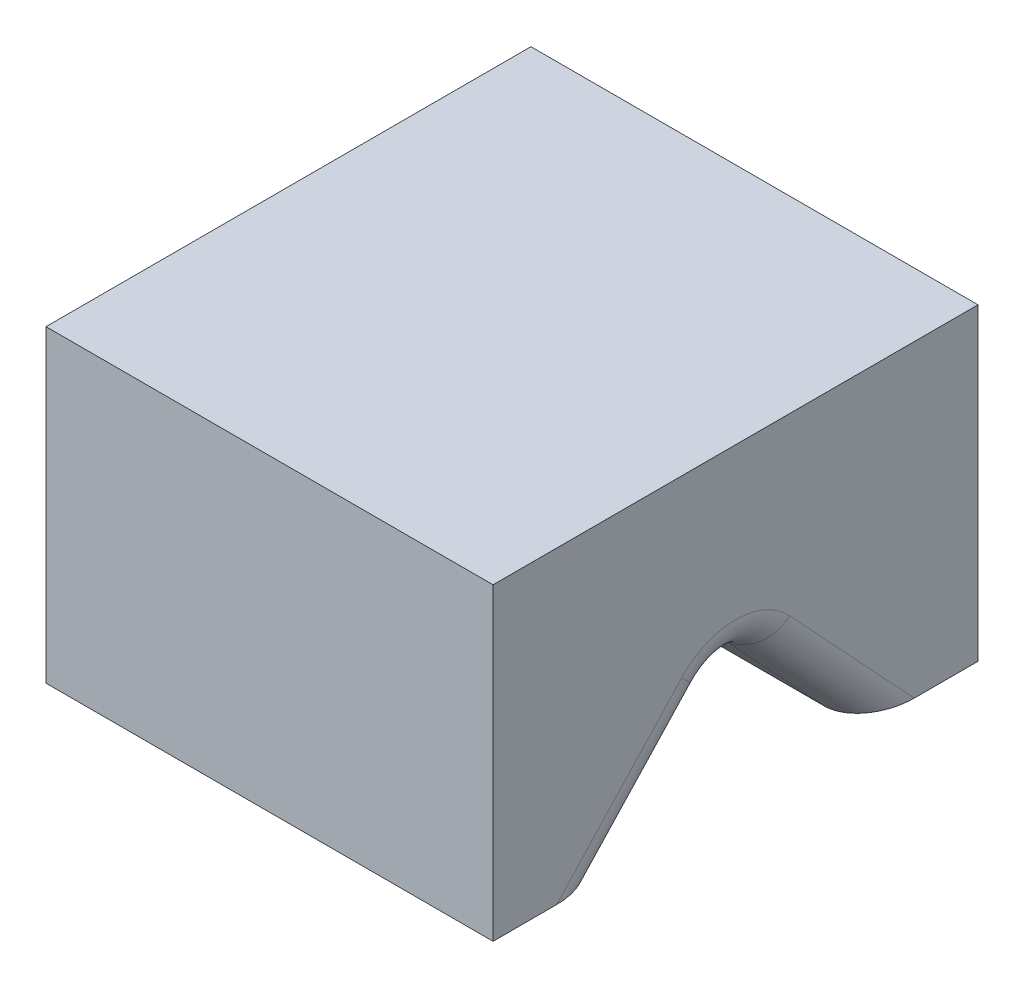
ISO-10303-21;
HEADER;
FILE_DESCRIPTION(('STEP AP214'),'2;1');
FILE_NAME('part.step','',(''),(''),'','','');
FILE_SCHEMA(('AUTOMOTIVE_DESIGN { 1 0 10303 214 1 1 1 1 }'));
ENDSEC;
DATA;
#1=APPLICATION_CONTEXT('core data for automotive mechanical design processes');
#2=APPLICATION_PROTOCOL_DEFINITION('international standard','automotive_design',2000,#1);
#3=PRODUCT_CONTEXT('',#1,'mechanical');
#4=PRODUCT('Part','Part','',(#3));
#5=PRODUCT_RELATED_PRODUCT_CATEGORY('part','',(#4));
#6=PRODUCT_DEFINITION_FORMATION('','',#4);
#7=PRODUCT_DEFINITION_CONTEXT('part definition',#1,'design');
#8=PRODUCT_DEFINITION('design','',#6,#7);
#9=PRODUCT_DEFINITION_SHAPE('','',#8);
#10=(LENGTH_UNIT() NAMED_UNIT(*) SI_UNIT(.MILLI.,.METRE.));
#11=(NAMED_UNIT(*) PLANE_ANGLE_UNIT() SI_UNIT($,.RADIAN.));
#12=(NAMED_UNIT(*) SI_UNIT($,.STERADIAN.) SOLID_ANGLE_UNIT());
#13=UNCERTAINTY_MEASURE_WITH_UNIT(LENGTH_MEASURE(1.E-05),#10,'distance_accuracy_value','');
#14=(GEOMETRIC_REPRESENTATION_CONTEXT(3) GLOBAL_UNCERTAINTY_ASSIGNED_CONTEXT((#13)) GLOBAL_UNIT_ASSIGNED_CONTEXT((#10,
#11,#12)) REPRESENTATION_CONTEXT('',''));
#15=CARTESIAN_POINT('',(0.,0.,0.));
#16=DIRECTION('',(0.,0.,1.));
#17=DIRECTION('',(1.,0.,0.));
#18=AXIS2_PLACEMENT_3D('',#15,#16,#17);
#19=CARTESIAN_POINT('',(0.,0.414017929910338,0.));
#20=DIRECTION('',(0.,1.,0.));
#21=DIRECTION('',(0.,0.,1.));
#22=AXIS2_PLACEMENT_3D('',#19,#20,#21);
#23=PLANE('',#22);
#24=DIRECTION('',(0.,0.,-1.));
#25=VECTOR('',#24,1.);
#26=CARTESIAN_POINT('',(-0.30226,0.414017929910338,1.50859998));
#27=LINE('',#26,#25);
#28=CARTESIAN_POINT('',(-0.30226,0.414017929910338,0.32512));
#29=VERTEX_POINT('',#28);
#30=CARTESIAN_POINT('',(-0.30226,0.414017929910338,-0.32512));
#31=VERTEX_POINT('',#30);
#32=EDGE_CURVE('E143',#29,#31,#27,.T.);
#33=ORIENTED_EDGE('',*,*,#32,.F.);
#34=DIRECTION('',(-1.,0.,0.));
#35=VECTOR('',#34,1.);
#36=CARTESIAN_POINT('',(1.50859998,0.414017929910338,0.32512));
#37=LINE('',#36,#35);
#38=CARTESIAN_POINT('',(0.29718,0.414017929910338,0.32512));
#39=VERTEX_POINT('',#38);
#40=EDGE_CURVE('E57',#39,#29,#37,.T.);
#41=ORIENTED_EDGE('',*,*,#40,.F.);
#42=DIRECTION('',(0.,0.,1.));
#43=VECTOR('',#42,1.);
#44=CARTESIAN_POINT('',(0.29718,0.414017929910338,1.50859998));
#45=LINE('',#44,#43);
#46=CARTESIAN_POINT('',(0.29718,0.414017929910338,-0.32512));
#47=VERTEX_POINT('',#46);
#48=EDGE_CURVE('E12',#47,#39,#45,.T.);
#49=ORIENTED_EDGE('',*,*,#48,.F.);
#50=DIRECTION('',(1.,0.,0.));
#51=VECTOR('',#50,1.);
#52=CARTESIAN_POINT('',(1.50859998,0.414017929910338,-0.32512));
#53=LINE('',#52,#51);
#54=EDGE_CURVE('E129',#31,#47,#53,.T.);
#55=ORIENTED_EDGE('',*,*,#54,.F.);
#56=EDGE_LOOP('',(#33,#41,#49,#55));
#57=FACE_BOUND('',#56,.T.);
#58=ADVANCED_FACE('F42',(#57),#23,.T.);
#59=CARTESIAN_POINT('',(1.50859998,-0.00999998000000009,-0.32512));
#60=DIRECTION('',(0.,0.,-1.));
#61=DIRECTION('',(-1.,0.,0.));
#62=AXIS2_PLACEMENT_3D('',#59,#60,#61);
#63=PLANE('',#62);
#64=DIRECTION('',(0.,1.,0.));
#65=VECTOR('',#64,1.);
#66=CARTESIAN_POINT('',(-0.30226,-0.00999998000000031,-0.32512));
#67=LINE('',#66,#65);
#68=CARTESIAN_POINT('',(-0.30226,0.,-0.32512));
#69=VERTEX_POINT('',#68);
#70=EDGE_CURVE('E142',#69,#31,#67,.T.);
#71=ORIENTED_EDGE('',*,*,#70,.T.);
#72=ORIENTED_EDGE('',*,*,#54,.T.);
#73=DIRECTION('',(0.,-1.,0.));
#74=VECTOR('',#73,1.);
#75=CARTESIAN_POINT('',(0.29718,-0.00999998000000002,-0.32512));
#76=LINE('',#75,#74);
#77=CARTESIAN_POINT('',(0.29718,0.,-0.32512));
#78=VERTEX_POINT('',#77);
#79=EDGE_CURVE('E139',#47,#78,#76,.T.);
#80=ORIENTED_EDGE('',*,*,#79,.T.);
#81=DIRECTION('',(-1.,0.,0.));
#82=VECTOR('',#81,1.);
#83=CARTESIAN_POINT('',(1.50859998,0.,-0.32512));
#84=LINE('',#83,#82);
#85=EDGE_CURVE('E334',#78,#69,#84,.T.);
#86=ORIENTED_EDGE('',*,*,#85,.T.);
#87=EDGE_LOOP('',(#71,#72,#80,#86));
#88=FACE_BOUND('',#87,.T.);
#89=ADVANCED_FACE('F137',(#88),#63,.T.);
#90=CARTESIAN_POINT('',(1.50859998,-0.00999998000000009,0.32512));
#91=DIRECTION('',(0.,0.,1.));
#92=DIRECTION('',(1.,0.,0.));
#93=AXIS2_PLACEMENT_3D('',#90,#91,#92);
#94=PLANE('',#93);
#95=DIRECTION('',(0.,1.,0.));
#96=VECTOR('',#95,1.);
#97=CARTESIAN_POINT('',(0.29718,-0.00999998000000002,0.32512));
#98=LINE('',#97,#96);
#99=CARTESIAN_POINT('',(0.29718,0.,0.32512));
#100=VERTEX_POINT('',#99);
#101=EDGE_CURVE('E170',#100,#39,#98,.T.);
#102=ORIENTED_EDGE('',*,*,#101,.T.);
#103=ORIENTED_EDGE('',*,*,#40,.T.);
#104=DIRECTION('',(0.,-1.,0.));
#105=VECTOR('',#104,1.);
#106=CARTESIAN_POINT('',(-0.30226,-0.00999998000000031,0.32512));
#107=LINE('',#106,#105);
#108=CARTESIAN_POINT('',(-0.30226,0.,0.32512));
#109=VERTEX_POINT('',#108);
#110=EDGE_CURVE('E149',#29,#109,#107,.T.);
#111=ORIENTED_EDGE('',*,*,#110,.T.);
#112=DIRECTION('',(-1.,0.,0.));
#113=VECTOR('',#112,1.);
#114=CARTESIAN_POINT('',(1.50859998,0.,0.32512));
#115=LINE('',#114,#113);
#116=EDGE_CURVE('E330',#100,#109,#115,.T.);
#117=ORIENTED_EDGE('',*,*,#116,.F.);
#118=EDGE_LOOP('',(#102,#103,#111,#117));
#119=FACE_BOUND('',#118,.T.);
#120=ADVANCED_FACE('F224',(#119),#94,.T.);
#121=CARTESIAN_POINT('',(-0.30226,0.88916002,1.50859998));
#122=DIRECTION('',(-1.,0.,0.));
#123=DIRECTION('',(0.,-1.,0.));
#124=AXIS2_PLACEMENT_3D('',#121,#122,#123);
#125=PLANE('',#124);
#126=ORIENTED_EDGE('',*,*,#110,.F.);
#127=ORIENTED_EDGE('',*,*,#32,.T.);
#128=ORIENTED_EDGE('',*,*,#70,.F.);
#129=DIRECTION('',(0.,0.,-1.));
#130=VECTOR('',#129,1.);
#131=CARTESIAN_POINT('',(-0.30226,0.,0.32512));
#132=LINE('',#131,#130);
#133=CARTESIAN_POINT('',(-0.30226,0.,-0.305652567595789));
#134=VERTEX_POINT('',#133);
#135=EDGE_CURVE('E151',#134,#69,#132,.T.);
#136=ORIENTED_EDGE('',*,*,#135,.F.);
#137=DIRECTION('',(0.,-0.731353701619172,-0.681998360062496));
#138=VECTOR('',#137,1.);
#139=CARTESIAN_POINT('',(-0.30226,0.212231998404407,-0.107743027322536));
#140=LINE('',#139,#138);
#141=CARTESIAN_POINT('',(-0.30226,0.212231998404407,-0.107743027322537));
#142=VERTEX_POINT('',#141);
#143=EDGE_CURVE('E308',#134,#142,#140,.F.);
#144=ORIENTED_EDGE('',*,*,#143,.T.);
#145=CARTESIAN_POINT('',(-0.30226,0.11176,0.));
#146=DIRECTION('',(-1.,0.,0.));
#147=DIRECTION('',(0.,-1.,0.));
#148=AXIS2_PLACEMENT_3D('',#145,#146,#147);
#149=CIRCLE('',#148,0.14732);
#150=CARTESIAN_POINT('',(-0.30226,0.212231998404407,0.107743027322537));
#151=VERTEX_POINT('',#150);
#152=EDGE_CURVE('E307',#142,#151,#149,.F.);
#153=ORIENTED_EDGE('',*,*,#152,.T.);
#154=DIRECTION('',(0.,0.731353701619173,-0.681998360062496));
#155=VECTOR('',#154,1.);
#156=CARTESIAN_POINT('',(-0.30226,0.0675587575477903,0.242653006981758));
#157=LINE('',#156,#155);
#158=CARTESIAN_POINT('',(-0.30226,0.,0.305652567595789));
#159=VERTEX_POINT('',#158);
#160=EDGE_CURVE('E305',#151,#159,#157,.F.);
#161=ORIENTED_EDGE('',*,*,#160,.T.);
#162=EDGE_CURVE('E167',#109,#159,#132,.T.);
#163=ORIENTED_EDGE('',*,*,#162,.F.);
#164=EDGE_LOOP('',(#126,#127,#128,#136,#144,#153,#161,#163));
#165=FACE_BOUND('',#164,.T.);
#166=ADVANCED_FACE('F336',(#165),#125,.T.);
#167=CARTESIAN_POINT('',(0.29718,-0.00999998,1.50859998));
#168=DIRECTION('',(1.,0.,0.));
#169=DIRECTION('',(0.,1.,0.));
#170=AXIS2_PLACEMENT_3D('',#167,#168,#169);
#171=PLANE('',#170);
#172=ORIENTED_EDGE('',*,*,#79,.F.);
#173=ORIENTED_EDGE('',*,*,#48,.T.);
#174=ORIENTED_EDGE('',*,*,#101,.F.);
#175=DIRECTION('',(0.,0.,1.));
#176=VECTOR('',#175,1.);
#177=CARTESIAN_POINT('',(0.29718,0.,0.32512));
#178=LINE('',#177,#176);
#179=CARTESIAN_POINT('',(0.29718,0.,0.239665344323171));
#180=VERTEX_POINT('',#179);
#181=EDGE_CURVE('E153',#180,#100,#178,.T.);
#182=ORIENTED_EDGE('',*,*,#181,.F.);
#183=DIRECTION('',(0.,-0.731353701619173,0.681998360062496));
#184=VECTOR('',#183,1.);
#185=CARTESIAN_POINT('',(0.29718,0.179318757547791,0.0724478976823953));
#186=LINE('',#185,#184);
#187=CARTESIAN_POINT('',(0.29718,0.179318757547791,0.0724478976823953));
#188=VERTEX_POINT('',#187);
#189=EDGE_CURVE('E261',#180,#188,#186,.F.);
#190=ORIENTED_EDGE('',*,*,#189,.T.);
#191=CARTESIAN_POINT('',(0.29718,0.11176,0.));
#192=DIRECTION('',(1.,0.,0.));
#193=DIRECTION('',(0.,1.,0.));
#194=AXIS2_PLACEMENT_3D('',#191,#192,#193);
#195=CIRCLE('',#194,0.0990600000000001);
#196=CARTESIAN_POINT('',(0.29718,0.179318757547791,-0.0724478976823953));
#197=VERTEX_POINT('',#196);
#198=EDGE_CURVE('E254',#188,#197,#195,.F.);
#199=ORIENTED_EDGE('',*,*,#198,.T.);
#200=DIRECTION('',(0.,0.731353701619172,0.681998360062496));
#201=VECTOR('',#200,1.);
#202=CARTESIAN_POINT('',(0.29718,0.0346455166911741,-0.207357877341617));
#203=LINE('',#202,#201);
#204=CARTESIAN_POINT('',(0.29718,0.,-0.239665344323171));
#205=VERTEX_POINT('',#204);
#206=EDGE_CURVE('E263',#197,#205,#203,.F.);
#207=ORIENTED_EDGE('',*,*,#206,.T.);
#208=EDGE_CURVE('E147',#78,#205,#178,.T.);
#209=ORIENTED_EDGE('',*,*,#208,.F.);
#210=EDGE_LOOP('',(#172,#173,#174,#182,#190,#199,#207,#209));
#211=FACE_BOUND('',#210,.T.);
#212=ADVANCED_FACE('F145',(#211),#171,.T.);
#213=CARTESIAN_POINT('',(0.,0.,0.));
#214=DIRECTION('',(0.,1.,0.));
#215=DIRECTION('',(0.,0.,1.));
#216=AXIS2_PLACEMENT_3D('',#213,#214,#215);
#217=PLANE('',#216);
#218=ORIENTED_EDGE('',*,*,#208,.T.);
#219=CARTESIAN_POINT('',(0.24638,0.,-0.239665344323171));
#220=DIRECTION('',(0.,1.,0.));
#221=DIRECTION('',(0.,0.,-1.));
#222=AXIS2_PLACEMENT_3D('',#219,#220,#221);
#223=ELLIPSE('',#222,0.0694602350238085,0.0508);
#224=CARTESIAN_POINT('',(0.24638,0.,-0.170205109299363));
#225=VERTEX_POINT('',#224);
#226=EDGE_CURVE('E265',#205,#225,#223,.F.);
#227=ORIENTED_EDGE('',*,*,#226,.T.);
#228=CARTESIAN_POINT('',(0.24638,0.,-0.170205109299363));
#229=DIRECTION('',(-1.,0.,0.));
#230=VECTOR('',#229,1.);
#231=LINE('',#228,#230);
#232=CARTESIAN_POINT('',(-0.2032,0.,-0.170205109299363));
#233=VERTEX_POINT('',#232);
#234=EDGE_CURVE('E249',#225,#233,#231,.T.);
#235=ORIENTED_EDGE('',*,*,#234,.T.);
#236=CARTESIAN_POINT('',(-0.2032,0.,-0.305652567595789));
#237=DIRECTION('',(0.,1.,0.));
#238=DIRECTION('',(0.,0.,1.));
#239=AXIS2_PLACEMENT_3D('',#236,#237,#238);
#240=ELLIPSE('',#239,0.135447458296426,0.09906);
#241=EDGE_CURVE('E255',#233,#134,#240,.F.);
#242=ORIENTED_EDGE('',*,*,#241,.T.);
#243=ORIENTED_EDGE('',*,*,#135,.T.);
#244=ORIENTED_EDGE('',*,*,#85,.F.);
#245=EDGE_LOOP('',(#218,#227,#235,#242,#243,#244));
#246=FACE_BOUND('',#245,.T.);
#247=ADVANCED_FACE('F191',(#246),#217,.F.);
#248=CARTESIAN_POINT('',(-0.2032,0.,0.170205109299363));
#249=DIRECTION('',(1.,0.,0.));
#250=VECTOR('',#249,1.);
#251=LINE('',#248,#250);
#252=CARTESIAN_POINT('',(-0.2032,0.,0.170205109299363));
#253=VERTEX_POINT('',#252);
#254=CARTESIAN_POINT('',(0.24638,0.,0.170205109299363));
#255=VERTEX_POINT('',#254);
#256=EDGE_CURVE('E318',#253,#255,#251,.T.);
#257=ORIENTED_EDGE('',*,*,#256,.T.);
#258=CARTESIAN_POINT('',(0.24638,0.,0.239665344323171));
#259=DIRECTION('',(0.,1.,0.));
#260=DIRECTION('',(0.,0.,-1.));
#261=AXIS2_PLACEMENT_3D('',#258,#259,#260);
#262=ELLIPSE('',#261,0.0694602350238084,0.0508);
#263=EDGE_CURVE('E271',#255,#180,#262,.F.);
#264=ORIENTED_EDGE('',*,*,#263,.T.);
#265=ORIENTED_EDGE('',*,*,#181,.T.);
#266=ORIENTED_EDGE('',*,*,#116,.T.);
#267=ORIENTED_EDGE('',*,*,#162,.T.);
#268=CARTESIAN_POINT('',(-0.2032,0.,0.305652567595789));
#269=DIRECTION('',(0.,1.,0.));
#270=DIRECTION('',(0.,0.,1.));
#271=AXIS2_PLACEMENT_3D('',#268,#269,#270);
#272=ELLIPSE('',#271,0.135447458296426,0.09906);
#273=EDGE_CURVE('E301',#159,#253,#272,.F.);
#274=ORIENTED_EDGE('',*,*,#273,.T.);
#275=EDGE_LOOP('',(#257,#264,#265,#266,#267,#274));
#276=FACE_BOUND('',#275,.T.);
#277=ADVANCED_FACE('F180',(#276),#217,.F.);
#278=CARTESIAN_POINT('',(-1.20142,0.144673240856616,-0.0352951296401414));
#279=DIRECTION('',(0.,0.681998360062496,-0.731353701619172));
#280=DIRECTION('',(0.,0.731353701619172,0.681998360062496));
#281=AXIS2_PLACEMENT_3D('',#278,#279,#280);
#282=PLANE('',#281);
#283=ORIENTED_EDGE('',*,*,#234,.F.);
#284=DIRECTION('',(0.,0.731353701619172,0.681998360062496));
#285=VECTOR('',#284,1.);
#286=CARTESIAN_POINT('',(0.24638,0.144673240856616,-0.0352951296401413));
#287=LINE('',#286,#285);
#288=CARTESIAN_POINT('',(0.24638,0.144673240856616,-0.0352951296401414));
#289=VERTEX_POINT('',#288);
#290=EDGE_CURVE('E252',#225,#289,#287,.T.);
#291=ORIENTED_EDGE('',*,*,#290,.T.);
#292=DIRECTION('',(1.,0.,0.));
#293=VECTOR('',#292,1.);
#294=CARTESIAN_POINT('',(-1.20142,0.144673240856616,-0.0352951296401414));
#295=LINE('',#294,#293);
#296=CARTESIAN_POINT('',(-0.2032,0.144673240856616,-0.0352951296401414));
#297=VERTEX_POINT('',#296);
#298=EDGE_CURVE('E290',#297,#289,#295,.T.);
#299=ORIENTED_EDGE('',*,*,#298,.F.);
#300=DIRECTION('',(0.,-0.731353701619172,-0.681998360062496));
#301=VECTOR('',#300,1.);
#302=CARTESIAN_POINT('',(-0.2032,0.,-0.170205109299363));
#303=LINE('',#302,#301);
#304=EDGE_CURVE('E295',#297,#233,#303,.T.);
#305=ORIENTED_EDGE('',*,*,#304,.T.);
#306=EDGE_LOOP('',(#283,#291,#299,#305));
#307=FACE_BOUND('',#306,.T.);
#308=ADVANCED_FACE('F190',(#307),#282,.F.);
#309=CARTESIAN_POINT('',(-1.20142,-0.00999998000000011,0.179530241510438));
#310=DIRECTION('',(0.,0.681998360062496,0.731353701619173));
#311=DIRECTION('',(0.,-0.731353701619173,0.681998360062496));
#312=AXIS2_PLACEMENT_3D('',#309,#310,#311);
#313=PLANE('',#312);
#314=DIRECTION('',(1.,0.,0.));
#315=VECTOR('',#314,1.);
#316=CARTESIAN_POINT('',(-1.20142,0.144673240856616,0.0352951296401414));
#317=LINE('',#316,#315);
#318=CARTESIAN_POINT('',(-0.2032,0.144673240856616,0.0352951296401414));
#319=VERTEX_POINT('',#318);
#320=CARTESIAN_POINT('',(0.24638,0.144673240856616,0.0352951296401414));
#321=VERTEX_POINT('',#320);
#322=EDGE_CURVE('E259',#319,#321,#317,.T.);
#323=ORIENTED_EDGE('',*,*,#322,.T.);
#324=DIRECTION('',(0.,-0.731353701619173,0.681998360062496));
#325=VECTOR('',#324,1.);
#326=CARTESIAN_POINT('',(0.24638,0.,0.170205109299363));
#327=LINE('',#326,#325);
#328=EDGE_CURVE('E267',#321,#255,#327,.T.);
#329=ORIENTED_EDGE('',*,*,#328,.T.);
#330=ORIENTED_EDGE('',*,*,#256,.F.);
#331=DIRECTION('',(0.,0.731353701619173,-0.681998360062496));
#332=VECTOR('',#331,1.);
#333=CARTESIAN_POINT('',(-0.2032,0.144673240856616,0.0352951296401412));
#334=LINE('',#333,#332);
#335=EDGE_CURVE('E309',#253,#319,#334,.T.);
#336=ORIENTED_EDGE('',*,*,#335,.T.);
#337=EDGE_LOOP('',(#323,#329,#330,#336));
#338=FACE_BOUND('',#337,.T.);
#339=ADVANCED_FACE('F229',(#338),#313,.F.);
#340=CARTESIAN_POINT('',(-1.20142,0.11176,0.));
#341=DIRECTION('',(1.,0.,0.));
#342=DIRECTION('',(0.,0.,-1.));
#343=AXIS2_PLACEMENT_3D('',#340,#341,#342);
#344=CYLINDRICAL_SURFACE('',#343,0.0482600000000002);
#345=ORIENTED_EDGE('',*,*,#298,.T.);
#346=CARTESIAN_POINT('',(0.24638,0.11176,0.));
#347=DIRECTION('',(1.,0.,0.));
#348=DIRECTION('',(0.,1.,0.));
#349=AXIS2_PLACEMENT_3D('',#346,#347,#348);
#350=CIRCLE('',#349,0.0482600000000002);
#351=EDGE_CURVE('E50',#289,#321,#350,.T.);
#352=ORIENTED_EDGE('',*,*,#351,.T.);
#353=ORIENTED_EDGE('',*,*,#322,.F.);
#354=CARTESIAN_POINT('',(-0.2032,0.11176,0.));
#355=DIRECTION('',(-1.,0.,0.));
#356=DIRECTION('',(0.,-1.,0.));
#357=AXIS2_PLACEMENT_3D('',#354,#355,#356);
#358=CIRCLE('',#357,0.0482600000000002);
#359=EDGE_CURVE('E299',#319,#297,#358,.T.);
#360=ORIENTED_EDGE('',*,*,#359,.T.);
#361=EDGE_LOOP('',(#345,#352,#353,#360));
#362=FACE_BOUND('',#361,.T.);
#363=ADVANCED_FACE('F206',(#362),#344,.F.);
#364=CARTESIAN_POINT('',(-0.2032,0.212231998404407,-0.107743027322537));
#365=DIRECTION('',(0.,0.731353701619172,0.681998360062496));
#366=DIRECTION('',(0.,-0.681998360062496,0.731353701619172));
#367=AXIS2_PLACEMENT_3D('',#364,#365,#366);
#368=CYLINDRICAL_SURFACE('',#367,0.09906);
#369=ORIENTED_EDGE('',*,*,#241,.F.);
#370=ORIENTED_EDGE('',*,*,#304,.F.);
#371=CARTESIAN_POINT('',(-0.2032,0.212231998404407,-0.107743027322537));
#372=DIRECTION('',(0.,0.731353701619172,0.681998360062497));
#373=DIRECTION('',(0.,-0.681998360062497,0.731353701619172));
#374=AXIS2_PLACEMENT_3D('',#371,#372,#373);
#375=CIRCLE('',#374,0.09906);
#376=EDGE_CURVE('E283',#142,#297,#375,.T.);
#377=ORIENTED_EDGE('',*,*,#376,.F.);
#378=ORIENTED_EDGE('',*,*,#143,.F.);
#379=EDGE_LOOP('',(#369,#370,#377,#378));
#380=FACE_BOUND('',#379,.T.);
#381=ADVANCED_FACE('F202',(#380),#368,.T.);
#382=CARTESIAN_POINT('',(-0.2032,0.11176,0.));
#383=DIRECTION('',(-1.,0.,0.));
#384=DIRECTION('',(0.,-1.,0.));
#385=AXIS2_PLACEMENT_3D('',#382,#383,#384);
#386=TOROIDAL_SURFACE('',#385,0.14732,0.09906);
#387=ORIENTED_EDGE('',*,*,#376,.T.);
#388=ORIENTED_EDGE('',*,*,#359,.F.);
#389=CARTESIAN_POINT('',(-0.2032,0.212231998404407,0.107743027322537));
#390=DIRECTION('',(0.,-0.731353701619173,0.681998360062496));
#391=DIRECTION('',(0.,-0.681998360062496,-0.731353701619173));
#392=AXIS2_PLACEMENT_3D('',#389,#390,#391);
#393=CIRCLE('',#392,0.09906);
#394=EDGE_CURVE('E280',#151,#319,#393,.T.);
#395=ORIENTED_EDGE('',*,*,#394,.F.);
#396=ORIENTED_EDGE('',*,*,#152,.F.);
#397=EDGE_LOOP('',(#387,#388,#395,#396));
#398=FACE_BOUND('',#397,.T.);
#399=ADVANCED_FACE('F198',(#398),#386,.T.);
#400=CARTESIAN_POINT('',(-0.2032,0.0575587775477908,0.251978139192833));
#401=DIRECTION('',(0.,-0.731353701619173,0.681998360062496));
#402=DIRECTION('',(0.,-0.681998360062496,-0.731353701619173));
#403=AXIS2_PLACEMENT_3D('',#400,#401,#402);
#404=CYLINDRICAL_SURFACE('',#403,0.09906);
#405=ORIENTED_EDGE('',*,*,#273,.F.);
#406=ORIENTED_EDGE('',*,*,#160,.F.);
#407=ORIENTED_EDGE('',*,*,#394,.T.);
#408=ORIENTED_EDGE('',*,*,#335,.F.);
#409=EDGE_LOOP('',(#405,#406,#407,#408));
#410=FACE_BOUND('',#409,.T.);
#411=ADVANCED_FACE('F194',(#410),#404,.T.);
#412=CARTESIAN_POINT('',(0.24638,0.0246455366911746,0.216683009552692));
#413=DIRECTION('',(0.,0.731353701619173,-0.681998360062496));
#414=DIRECTION('',(0.,0.681998360062496,0.731353701619173));
#415=AXIS2_PLACEMENT_3D('',#412,#413,#414);
#416=CYLINDRICAL_SURFACE('',#415,0.0508);
#417=ORIENTED_EDGE('',*,*,#263,.F.);
#418=ORIENTED_EDGE('',*,*,#328,.F.);
#419=CARTESIAN_POINT('',(0.24638,0.179318757547791,0.0724478976823953));
#420=DIRECTION('',(0.,0.731353701619173,-0.681998360062496));
#421=DIRECTION('',(0.,0.681998360062496,0.731353701619173));
#422=AXIS2_PLACEMENT_3D('',#419,#420,#421);
#423=CIRCLE('',#422,0.0508);
#424=EDGE_CURVE('E279',#188,#321,#423,.T.);
#425=ORIENTED_EDGE('',*,*,#424,.F.);
#426=ORIENTED_EDGE('',*,*,#189,.F.);
#427=EDGE_LOOP('',(#417,#418,#425,#426));
#428=FACE_BOUND('',#427,.T.);
#429=ADVANCED_FACE('F44',(#428),#416,.T.);
#430=CARTESIAN_POINT('',(0.24638,0.11176,0.));
#431=DIRECTION('',(1.,0.,0.));
#432=DIRECTION('',(0.,1.,0.));
#433=AXIS2_PLACEMENT_3D('',#430,#431,#432);
#434=TOROIDAL_SURFACE('',#433,0.0990600000000001,0.0508);
#435=ORIENTED_EDGE('',*,*,#424,.T.);
#436=ORIENTED_EDGE('',*,*,#351,.F.);
#437=CARTESIAN_POINT('',(0.24638,0.179318757547791,-0.0724478976823953));
#438=DIRECTION('',(0.,-0.731353701619172,-0.681998360062496));
#439=DIRECTION('',(0.,0.681998360062496,-0.731353701619172));
#440=AXIS2_PLACEMENT_3D('',#437,#438,#439);
#441=CIRCLE('',#440,0.0508);
#442=EDGE_CURVE('E278',#197,#289,#441,.T.);
#443=ORIENTED_EDGE('',*,*,#442,.F.);
#444=ORIENTED_EDGE('',*,*,#198,.F.);
#445=EDGE_LOOP('',(#435,#436,#443,#444));
#446=FACE_BOUND('',#445,.T.);
#447=ADVANCED_FACE('F210',(#446),#434,.T.);
#448=CARTESIAN_POINT('',(0.24638,0.179318757547791,-0.0724478976823954));
#449=DIRECTION('',(0.,-0.731353701619172,-0.681998360062496));
#450=DIRECTION('',(0.,0.681998360062496,-0.731353701619172));
#451=AXIS2_PLACEMENT_3D('',#448,#449,#450);
#452=CYLINDRICAL_SURFACE('',#451,0.0508);
#453=ORIENTED_EDGE('',*,*,#226,.F.);
#454=ORIENTED_EDGE('',*,*,#206,.F.);
#455=ORIENTED_EDGE('',*,*,#442,.T.);
#456=ORIENTED_EDGE('',*,*,#290,.F.);
#457=EDGE_LOOP('',(#453,#454,#455,#456));
#458=FACE_BOUND('',#457,.T.);
#459=ADVANCED_FACE('F208',(#458),#452,.T.);
#460=CLOSED_SHELL('',(#58,#89,#120,#166,#212,#247,#277,#308,#339,#363,#381,#399,#411,#429,#447,#459));
#461=MANIFOLD_SOLID_BREP('B2',#460);
#462=ADVANCED_BREP_SHAPE_REPRESENTATION('',(#18,#461),#14);
#463=SHAPE_DEFINITION_REPRESENTATION(#9,#462);
ENDSEC;
END-ISO-10303-21;
